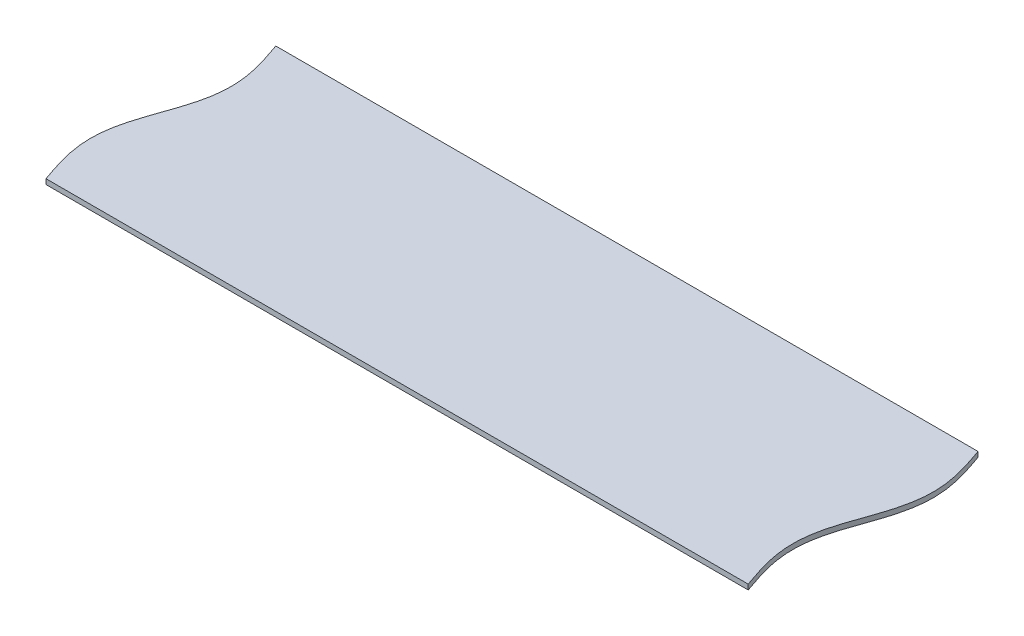
ISO-10303-21;
HEADER;
FILE_DESCRIPTION(('STEP AP214'),'2;1');
FILE_NAME('part.step','',(''),(''),'','','');
FILE_SCHEMA(('AUTOMOTIVE_DESIGN { 1 0 10303 214 1 1 1 1 }'));
ENDSEC;
DATA;
#1=APPLICATION_CONTEXT('core data for automotive mechanical design processes');
#2=APPLICATION_PROTOCOL_DEFINITION('international standard','automotive_design',2000,#1);
#3=PRODUCT_CONTEXT('',#1,'mechanical');
#4=PRODUCT('Part','Part','',(#3));
#5=PRODUCT_RELATED_PRODUCT_CATEGORY('part','',(#4));
#6=PRODUCT_DEFINITION_FORMATION('','',#4);
#7=PRODUCT_DEFINITION_CONTEXT('part definition',#1,'design');
#8=PRODUCT_DEFINITION('design','',#6,#7);
#9=PRODUCT_DEFINITION_SHAPE('','',#8);
#10=(LENGTH_UNIT() NAMED_UNIT(*) SI_UNIT(.MILLI.,.METRE.));
#11=(NAMED_UNIT(*) PLANE_ANGLE_UNIT() SI_UNIT($,.RADIAN.));
#12=(NAMED_UNIT(*) SI_UNIT($,.STERADIAN.) SOLID_ANGLE_UNIT());
#13=UNCERTAINTY_MEASURE_WITH_UNIT(LENGTH_MEASURE(1.E-05),#10,'distance_accuracy_value','');
#14=(GEOMETRIC_REPRESENTATION_CONTEXT(3) GLOBAL_UNCERTAINTY_ASSIGNED_CONTEXT((#13)) GLOBAL_UNIT_ASSIGNED_CONTEXT((#10,
#11,#12)) REPRESENTATION_CONTEXT('',''));
#15=CARTESIAN_POINT('',(0.,0.,0.));
#16=DIRECTION('',(0.,0.,1.));
#17=DIRECTION('',(1.,0.,0.));
#18=AXIS2_PLACEMENT_3D('',#15,#16,#17);
#19=CARTESIAN_POINT('',(3.51346725422242E-13,0.4,9.99607297977323E-13));
#20=CARTESIAN_POINT('',(0.0396658953187112,0.4,0.113629059631527));
#21=CARTESIAN_POINT('',(0.127828782984437,0.4,0.36625121292642));
#22=CARTESIAN_POINT('',(0.314067233438055,0.4,0.905134946335045));
#23=CARTESIAN_POINT('',(0.447833384221101,0.4,1.32443330294684));
#24=CARTESIAN_POINT('',(0.628652947897457,0.4,1.92673846966747));
#25=CARTESIAN_POINT('',(0.760019443823043,0.4,2.45022095533356));
#26=CARTESIAN_POINT('',(0.886445316239898,0.4,3.0599775005863));
#27=CARTESIAN_POINT('',(0.968644219694472,0.4,3.68229154129372));
#28=CARTESIAN_POINT('',(1.00957356894756,0.4,4.32595026718988));
#29=CARTESIAN_POINT('',(0.997152388108261,0.4,4.96085087424601));
#30=CARTESIAN_POINT('',(0.937709737366885,0.4,5.5987976395287));
#31=CARTESIAN_POINT('',(0.832282966724432,0.4,6.22738282701376));
#32=CARTESIAN_POINT('',(0.653956328235552,0.4,7.00505920077901));
#33=CARTESIAN_POINT('',(0.379683241987122,0.4,7.92138576786747));
#34=CARTESIAN_POINT('',(0.0104849968596743,0.4,8.97483588461719));
#35=CARTESIAN_POINT('',(-0.362900485129284,0.4,10.0340689701101));
#36=CARTESIAN_POINT('',(-0.641899168003575,0.4,10.958556194955));
#37=CARTESIAN_POINT('',(-0.824991279867973,0.4,11.7426660500741));
#38=CARTESIAN_POINT('',(-0.932695791526678,0.4,12.3804195608281));
#39=CARTESIAN_POINT('',(-0.995234806322172,0.4,13.01476021234));
#40=CARTESIAN_POINT('',(-1.00762455180541,0.4,13.6554743755161));
#41=CARTESIAN_POINT('',(-0.972166314938343,0.4,14.2892327502075));
#42=CARTESIAN_POINT('',(-0.896310415639417,0.4,14.8497353838832));
#43=CARTESIAN_POINT('',(-0.818324216665541,0.4,15.270577842647));
#44=CARTESIAN_POINT('',(-0.743461812996477,0.4,15.5964275903739));
#45=CARTESIAN_POINT('',(-0.659613961053455,0.4,15.955694170016));
#46=CARTESIAN_POINT('',(-0.501876379927155,0.4,16.5013970646172));
#47=CARTESIAN_POINT('',(-0.373595901550365,0.4,16.921778114431));
#48=CARTESIAN_POINT('',(-0.131849072520512,0.4,17.6222634009616));
#49=CARTESIAN_POINT('',(-0.0438729901146728,0.4,17.8743159553688));
#50=CARTESIAN_POINT('',(-2.10118523329226E-10,0.4,17.9999999993981));
#51=B_SPLINE_CURVE_WITH_KNOTS('',4,(#19,#20,#21,#22,#23,#24,#25,#26,#27,#28,#29,#30,#31,#32,#33,
#34,#35,#36,#37,#38,#39,#40,#41,#42,#43,#44,#45,#46,#47,#48,#49,#50),.UNSPECIFIED.,.F.,.F.,(5,1,
1,1,1,1,1,1,1,1,1,1,1,1,1,1,1,1,1,1,1,1,1,1,1,1,1,1,5),(0.0856619248766515,0.111326290829048,
0.139967508220468,0.16251020722395,0.185052906227431,0.213694133763432,0.242335334647047,
0.270976523270062,0.299617709039037,0.328258915791857,0.356900078406982,0.38554127840654,
0.41418252725508,0.471334271143311,0.528616703833796,0.585899120236841,0.615912526668992,
0.64455372424183,0.673194931355435,0.70183610676469,0.730477285684824,0.759118500158374,
0.787759672897833,0.802080277829947,0.809240580296003,0.81640088276206,0.85998346777122,
0.888624684983677,0.917265902234015),.UNSPECIFIED.);
#52=DIRECTION('',(0.,-1.,0.));
#53=VECTOR('',#52,1.);
#54=SURFACE_OF_LINEAR_EXTRUSION('',#51,#53);
#55=CARTESIAN_POINT('',(3.51346725422242E-13,0.,9.99607297977323E-13));
#56=CARTESIAN_POINT('',(0.0396658953187112,0.,0.113629059631527));
#57=CARTESIAN_POINT('',(0.127828782984437,0.,0.36625121292642));
#58=CARTESIAN_POINT('',(0.314067233438055,0.,0.905134946335045));
#59=CARTESIAN_POINT('',(0.447833384221101,0.,1.32443330294684));
#60=CARTESIAN_POINT('',(0.628652947897457,0.,1.92673846966747));
#61=CARTESIAN_POINT('',(0.760019443823043,0.,2.45022095533356));
#62=CARTESIAN_POINT('',(0.886445316239898,0.,3.0599775005863));
#63=CARTESIAN_POINT('',(0.968644219694472,0.,3.68229154129372));
#64=CARTESIAN_POINT('',(1.00957356894756,0.,4.32595026718988));
#65=CARTESIAN_POINT('',(0.997152388108261,0.,4.96085087424601));
#66=CARTESIAN_POINT('',(0.937709737366885,0.,5.5987976395287));
#67=CARTESIAN_POINT('',(0.832282966724432,0.,6.22738282701376));
#68=CARTESIAN_POINT('',(0.653956328235552,0.,7.00505920077901));
#69=CARTESIAN_POINT('',(0.379683241987122,0.,7.92138576786747));
#70=CARTESIAN_POINT('',(0.0104849968596743,0.,8.97483588461719));
#71=CARTESIAN_POINT('',(-0.362900485129284,0.,10.0340689701101));
#72=CARTESIAN_POINT('',(-0.641899168003575,0.,10.958556194955));
#73=CARTESIAN_POINT('',(-0.824991279867973,0.,11.7426660500741));
#74=CARTESIAN_POINT('',(-0.932695791526678,0.,12.3804195608281));
#75=CARTESIAN_POINT('',(-0.995234806322172,0.,13.01476021234));
#76=CARTESIAN_POINT('',(-1.00762455180541,0.,13.6554743755161));
#77=CARTESIAN_POINT('',(-0.972166314938343,0.,14.2892327502075));
#78=CARTESIAN_POINT('',(-0.896310415639417,0.,14.8497353838832));
#79=CARTESIAN_POINT('',(-0.818324216665541,0.,15.270577842647));
#80=CARTESIAN_POINT('',(-0.743461812996477,0.,15.5964275903739));
#81=CARTESIAN_POINT('',(-0.659613961053455,0.,15.955694170016));
#82=CARTESIAN_POINT('',(-0.501876379927155,0.,16.5013970646172));
#83=CARTESIAN_POINT('',(-0.373595901550365,0.,16.921778114431));
#84=CARTESIAN_POINT('',(-0.131849072520512,0.,17.6222634009616));
#85=CARTESIAN_POINT('',(-0.0438729901146728,0.,17.8743159553688));
#86=CARTESIAN_POINT('',(-2.10118523329226E-10,0.,17.9999999993981));
#87=B_SPLINE_CURVE_WITH_KNOTS('',4,(#55,#56,#57,#58,#59,#60,#61,#62,#63,#64,#65,#66,#67,#68,#69,
#70,#71,#72,#73,#74,#75,#76,#77,#78,#79,#80,#81,#82,#83,#84,#85,#86),.UNSPECIFIED.,.F.,.F.,(5,1,
1,1,1,1,1,1,1,1,1,1,1,1,1,1,1,1,1,1,1,1,1,1,1,1,1,1,5),(0.0856619248766515,0.111326290829048,
0.139967508220468,0.16251020722395,0.185052906227431,0.213694133763432,0.242335334647047,
0.270976523270062,0.299617709039037,0.328258915791857,0.356900078406982,0.38554127840654,
0.41418252725508,0.471334271143311,0.528616703833796,0.585899120236841,0.615912526668992,
0.64455372424183,0.673194931355435,0.70183610676469,0.730477285684824,0.759118500158374,
0.787759672897833,0.802080277829947,0.809240580296003,0.81640088276206,0.85998346777122,
0.888624684983677,0.917265902234015),.UNSPECIFIED.);
#88=CARTESIAN_POINT('',(0.,0.,0.));
#89=VERTEX_POINT('',#88);
#90=CARTESIAN_POINT('',(0.,0.,18.));
#91=VERTEX_POINT('',#90);
#92=EDGE_CURVE('E122',#89,#91,#87,.T.);
#93=ORIENTED_EDGE('',*,*,#92,.T.);
#94=DIRECTION('',(0.,-1.,0.));
#95=VECTOR('',#94,1.);
#96=CARTESIAN_POINT('',(0.,0.4,18.));
#97=LINE('',#96,#95);
#98=CARTESIAN_POINT('',(0.,0.4,18.));
#99=VERTEX_POINT('',#98);
#100=EDGE_CURVE('E11',#99,#91,#97,.T.);
#101=ORIENTED_EDGE('',*,*,#100,.F.);
#102=CARTESIAN_POINT('',(0.,0.4,0.));
#103=VERTEX_POINT('',#102);
#104=EDGE_CURVE('E91',#103,#99,#51,.T.);
#105=ORIENTED_EDGE('',*,*,#104,.F.);
#106=DIRECTION('',(0.,-1.,0.));
#107=VECTOR('',#106,1.);
#108=CARTESIAN_POINT('',(0.,0.4,0.));
#109=LINE('',#108,#107);
#110=EDGE_CURVE('E99',#103,#89,#109,.T.);
#111=ORIENTED_EDGE('',*,*,#110,.T.);
#112=EDGE_LOOP('',(#93,#101,#105,#111));
#113=FACE_BOUND('',#112,.T.);
#114=ADVANCED_FACE('F39',(#113),#54,.F.);
#115=CARTESIAN_POINT('',(54.999999999673,0.4,18.));
#116=DIRECTION('',(0.,0.,-1.));
#117=DIRECTION('',(-1.,0.,0.));
#118=AXIS2_PLACEMENT_3D('',#115,#116,#117);
#119=PLANE('',#118);
#120=DIRECTION('',(1.,0.,0.));
#121=VECTOR('',#120,1.);
#122=CARTESIAN_POINT('',(54.999999999673,0.,18.));
#123=LINE('',#122,#121);
#124=CARTESIAN_POINT('',(54.9999999994629,0.,17.9999999993981));
#125=VERTEX_POINT('',#124);
#126=EDGE_CURVE('E95',#91,#125,#123,.T.);
#127=ORIENTED_EDGE('',*,*,#126,.T.);
#128=DIRECTION('',(0.,-1.,0.));
#129=VECTOR('',#128,1.);
#130=CARTESIAN_POINT('',(54.9999999994629,0.4,17.9999999993981));
#131=LINE('',#130,#129);
#132=CARTESIAN_POINT('',(54.9999999994629,0.4,17.9999999993981));
#133=VERTEX_POINT('',#132);
#134=EDGE_CURVE('E48',#133,#125,#131,.T.);
#135=ORIENTED_EDGE('',*,*,#134,.F.);
#136=DIRECTION('',(1.,0.,0.));
#137=VECTOR('',#136,1.);
#138=CARTESIAN_POINT('',(54.999999999673,0.4,18.));
#139=LINE('',#138,#137);
#140=EDGE_CURVE('E86',#99,#133,#139,.T.);
#141=ORIENTED_EDGE('',*,*,#140,.F.);
#142=ORIENTED_EDGE('',*,*,#100,.T.);
#143=EDGE_LOOP('',(#127,#135,#141,#142));
#144=FACE_BOUND('',#143,.T.);
#145=ADVANCED_FACE('F94',(#144),#119,.F.);
#146=CARTESIAN_POINT('',(54.9999999994629,0.4,17.9999999993981));
#147=CARTESIAN_POINT('',(54.9561270095606,0.4,17.874315955368));
#148=CARTESIAN_POINT('',(54.8681509271594,0.4,17.6222634009592));
#149=CARTESIAN_POINT('',(54.6264040981422,0.4,16.9217781144242));
#150=CARTESIAN_POINT('',(54.4981236197731,0.4,16.501397064608));
#151=CARTESIAN_POINT('',(54.3403860386567,0.4,15.955694170004));
#152=CARTESIAN_POINT('',(54.2565381867202,0.4,15.5964275903604));
#153=CARTESIAN_POINT('',(54.181675783057,0.4,15.2705778426321));
#154=CARTESIAN_POINT('',(54.1036895840908,0.4,14.8497353838669));
#155=CARTESIAN_POINT('',(54.0278336848021,0.4,14.2892327501898));
#156=CARTESIAN_POINT('',(53.9923754479465,0.4,13.6554743754978));
#157=CARTESIAN_POINT('',(54.0047651934414,0.4,13.0147602123219));
#158=CARTESIAN_POINT('',(54.0673042082484,0.4,12.3804195608112));
#159=CARTESIAN_POINT('',(54.1750087199187,0.4,11.7426660500591));
#160=CARTESIAN_POINT('',(54.3581008317973,0.4,10.9585561949433));
#161=CARTESIAN_POINT('',(54.6370995146884,0.4,10.0340689701035));
#162=CARTESIAN_POINT('',(55.0104849966966,0.4,8.97483588461739));
#163=CARTESIAN_POINT('',(55.3796832418432,0.4,7.92138576787438));
#164=CARTESIAN_POINT('',(55.6539563281083,0.4,7.00505920079089));
#165=CARTESIAN_POINT('',(55.8322829666113,0.4,6.22738282702889));
#166=CARTESIAN_POINT('',(55.9377097372652,0.4,5.59879763954574));
#167=CARTESIAN_POINT('',(55.9971523880181,0.4,4.96085087426414));
#168=CARTESIAN_POINT('',(56.009573568869,0.4,4.32595026720823));
#169=CARTESIAN_POINT('',(55.9686442196276,0.4,3.68229154131133));
#170=CARTESIAN_POINT('',(55.8864453161843,0.4,3.05997750060242));
#171=CARTESIAN_POINT('',(55.7600194437785,0.4,2.45022095534738));
#172=CARTESIAN_POINT('',(55.6286529478624,0.4,1.92673846967889));
#173=CARTESIAN_POINT('',(55.447833384197,0.4,1.32443330295498));
#174=CARTESIAN_POINT('',(55.3140672334216,0.4,0.905134946340758));
#175=CARTESIAN_POINT('',(55.1278287829778,0.4,0.366251212928747));
#176=CARTESIAN_POINT('',(55.0396658953166,0.4,0.113629059632252));
#177=CARTESIAN_POINT('',(55.0000000000003,0.4,1.00251600911819E-12));
#178=B_SPLINE_CURVE_WITH_KNOTS('',4,(#146,#147,#148,#149,#150,#151,#152,#153,#154,#155,#156,
#157,#158,#159,#160,#161,#162,#163,#164,#165,#166,#167,#168,#169,#170,#171,#172,#173,#174,#175,
#176,#177),.UNSPECIFIED.,.F.,.F.,(5,1,1,1,1,1,1,1,1,1,1,1,1,1,1,1,1,1,1,1,1,1,1,1,1,1,1,1,5),
(0.0856619248766511,0.114303142126988,0.142944359339444,0.186526944348605,0.193687246814662,
0.200847549280718,0.215168154212832,0.243809326952291,0.272450541425841,0.301091720345975,
0.32973289575523,0.358374102868835,0.387015300441673,0.417028706873824,0.474311123276869,
0.531593555967354,0.588745299855585,0.617386548704125,0.646027748703683,0.674668911318807,
0.703310118071628,0.731951303840603,0.760592492463618,0.789233693347233,0.817874920883234,
0.840417619886715,0.862960318890197,0.891601536281617,0.917265902234014),.UNSPECIFIED.);
#179=DIRECTION('',(0.,-1.,0.));
#180=VECTOR('',#179,1.);
#181=SURFACE_OF_LINEAR_EXTRUSION('',#178,#180);
#182=CARTESIAN_POINT('',(54.9999999994629,0.,17.9999999993981));
#183=CARTESIAN_POINT('',(54.9561270095606,0.,17.874315955368));
#184=CARTESIAN_POINT('',(54.8681509271594,0.,17.6222634009592));
#185=CARTESIAN_POINT('',(54.6264040981422,0.,16.9217781144242));
#186=CARTESIAN_POINT('',(54.4981236197731,0.,16.501397064608));
#187=CARTESIAN_POINT('',(54.3403860386567,0.,15.955694170004));
#188=CARTESIAN_POINT('',(54.2565381867202,0.,15.5964275903604));
#189=CARTESIAN_POINT('',(54.181675783057,0.,15.2705778426321));
#190=CARTESIAN_POINT('',(54.1036895840908,0.,14.8497353838669));
#191=CARTESIAN_POINT('',(54.0278336848021,0.,14.2892327501898));
#192=CARTESIAN_POINT('',(53.9923754479465,0.,13.6554743754978));
#193=CARTESIAN_POINT('',(54.0047651934414,0.,13.0147602123219));
#194=CARTESIAN_POINT('',(54.0673042082484,0.,12.3804195608112));
#195=CARTESIAN_POINT('',(54.1750087199187,0.,11.7426660500591));
#196=CARTESIAN_POINT('',(54.3581008317973,0.,10.9585561949433));
#197=CARTESIAN_POINT('',(54.6370995146884,0.,10.0340689701035));
#198=CARTESIAN_POINT('',(55.0104849966966,0.,8.97483588461739));
#199=CARTESIAN_POINT('',(55.3796832418432,0.,7.92138576787438));
#200=CARTESIAN_POINT('',(55.6539563281083,0.,7.00505920079089));
#201=CARTESIAN_POINT('',(55.8322829666113,0.,6.22738282702889));
#202=CARTESIAN_POINT('',(55.9377097372652,0.,5.59879763954574));
#203=CARTESIAN_POINT('',(55.9971523880181,0.,4.96085087426414));
#204=CARTESIAN_POINT('',(56.009573568869,0.,4.32595026720823));
#205=CARTESIAN_POINT('',(55.9686442196276,0.,3.68229154131133));
#206=CARTESIAN_POINT('',(55.8864453161843,0.,3.05997750060242));
#207=CARTESIAN_POINT('',(55.7600194437785,0.,2.45022095534738));
#208=CARTESIAN_POINT('',(55.6286529478624,0.,1.92673846967889));
#209=CARTESIAN_POINT('',(55.447833384197,0.,1.32443330295498));
#210=CARTESIAN_POINT('',(55.3140672334216,0.,0.905134946340758));
#211=CARTESIAN_POINT('',(55.1278287829778,0.,0.366251212928747));
#212=CARTESIAN_POINT('',(55.0396658953166,0.,0.113629059632252));
#213=CARTESIAN_POINT('',(55.0000000000003,0.,1.00251600911819E-12));
#214=B_SPLINE_CURVE_WITH_KNOTS('',4,(#182,#183,#184,#185,#186,#187,#188,#189,#190,#191,#192,
#193,#194,#195,#196,#197,#198,#199,#200,#201,#202,#203,#204,#205,#206,#207,#208,#209,#210,#211,
#212,#213),.UNSPECIFIED.,.F.,.F.,(5,1,1,1,1,1,1,1,1,1,1,1,1,1,1,1,1,1,1,1,1,1,1,1,1,1,1,1,5),
(0.0856619248766511,0.114303142126988,0.142944359339444,0.186526944348605,0.193687246814662,
0.200847549280718,0.215168154212832,0.243809326952291,0.272450541425841,0.301091720345975,
0.32973289575523,0.358374102868835,0.387015300441673,0.417028706873824,0.474311123276869,
0.531593555967354,0.588745299855585,0.617386548704125,0.646027748703683,0.674668911318807,
0.703310118071628,0.731951303840603,0.760592492463618,0.789233693347233,0.817874920883234,
0.840417619886715,0.862960318890197,0.891601536281617,0.917265902234014),.UNSPECIFIED.);
#215=CARTESIAN_POINT('',(55.,0.,0.));
#216=VERTEX_POINT('',#215);
#217=EDGE_CURVE('E73',#125,#216,#214,.T.);
#218=ORIENTED_EDGE('',*,*,#217,.T.);
#219=DIRECTION('',(0.,-1.,0.));
#220=VECTOR('',#219,1.);
#221=CARTESIAN_POINT('',(55.,0.4,0.));
#222=LINE('',#221,#220);
#223=CARTESIAN_POINT('',(55.,0.4,0.));
#224=VERTEX_POINT('',#223);
#225=EDGE_CURVE('E96',#224,#216,#222,.T.);
#226=ORIENTED_EDGE('',*,*,#225,.F.);
#227=EDGE_CURVE('E89',#133,#224,#178,.T.);
#228=ORIENTED_EDGE('',*,*,#227,.F.);
#229=ORIENTED_EDGE('',*,*,#134,.T.);
#230=EDGE_LOOP('',(#218,#226,#228,#229));
#231=FACE_BOUND('',#230,.T.);
#232=ADVANCED_FACE('F97',(#231),#181,.F.);
#233=CARTESIAN_POINT('',(0.,0.4,0.));
#234=DIRECTION('',(0.,0.,1.));
#235=DIRECTION('',(1.,0.,0.));
#236=AXIS2_PLACEMENT_3D('',#233,#234,#235);
#237=PLANE('',#236);
#238=DIRECTION('',(-1.,0.,0.));
#239=VECTOR('',#238,1.);
#240=CARTESIAN_POINT('',(0.,0.,0.));
#241=LINE('',#240,#239);
#242=EDGE_CURVE('E79',#216,#89,#241,.T.);
#243=ORIENTED_EDGE('',*,*,#242,.T.);
#244=ORIENTED_EDGE('',*,*,#110,.F.);
#245=DIRECTION('',(-1.,0.,0.));
#246=VECTOR('',#245,1.);
#247=CARTESIAN_POINT('',(0.,0.4,0.));
#248=LINE('',#247,#246);
#249=EDGE_CURVE('E56',#224,#103,#248,.T.);
#250=ORIENTED_EDGE('',*,*,#249,.F.);
#251=ORIENTED_EDGE('',*,*,#225,.T.);
#252=EDGE_LOOP('',(#243,#244,#250,#251));
#253=FACE_BOUND('',#252,.T.);
#254=ADVANCED_FACE('F111',(#253),#237,.F.);
#255=CARTESIAN_POINT('',(-0.000585507945594374,0.4,9.00513087132899));
#256=DIRECTION('',(0.,1.,0.));
#257=DIRECTION('',(0.,0.,1.));
#258=AXIS2_PLACEMENT_3D('',#255,#256,#257);
#259=PLANE('',#258);
#260=ORIENTED_EDGE('',*,*,#104,.T.);
#261=ORIENTED_EDGE('',*,*,#140,.T.);
#262=ORIENTED_EDGE('',*,*,#227,.T.);
#263=ORIENTED_EDGE('',*,*,#249,.T.);
#264=EDGE_LOOP('',(#260,#261,#262,#263));
#265=FACE_BOUND('',#264,.T.);
#266=ADVANCED_FACE('F87',(#265),#259,.T.);
#267=CARTESIAN_POINT('',(-0.000585507945594374,0.,9.00513087132899));
#268=DIRECTION('',(0.,1.,0.));
#269=DIRECTION('',(0.,0.,1.));
#270=AXIS2_PLACEMENT_3D('',#267,#268,#269);
#271=PLANE('',#270);
#272=ORIENTED_EDGE('',*,*,#92,.F.);
#273=ORIENTED_EDGE('',*,*,#242,.F.);
#274=ORIENTED_EDGE('',*,*,#217,.F.);
#275=ORIENTED_EDGE('',*,*,#126,.F.);
#276=EDGE_LOOP('',(#272,#273,#274,#275));
#277=FACE_BOUND('',#276,.T.);
#278=ADVANCED_FACE('F139',(#277),#271,.F.);
#279=CLOSED_SHELL('',(#114,#145,#232,#254,#266,#278));
#280=MANIFOLD_SOLID_BREP('B2',#279);
#281=ADVANCED_BREP_SHAPE_REPRESENTATION('',(#18,#280),#14);
#282=SHAPE_DEFINITION_REPRESENTATION(#9,#281);
ENDSEC;
END-ISO-10303-21;
